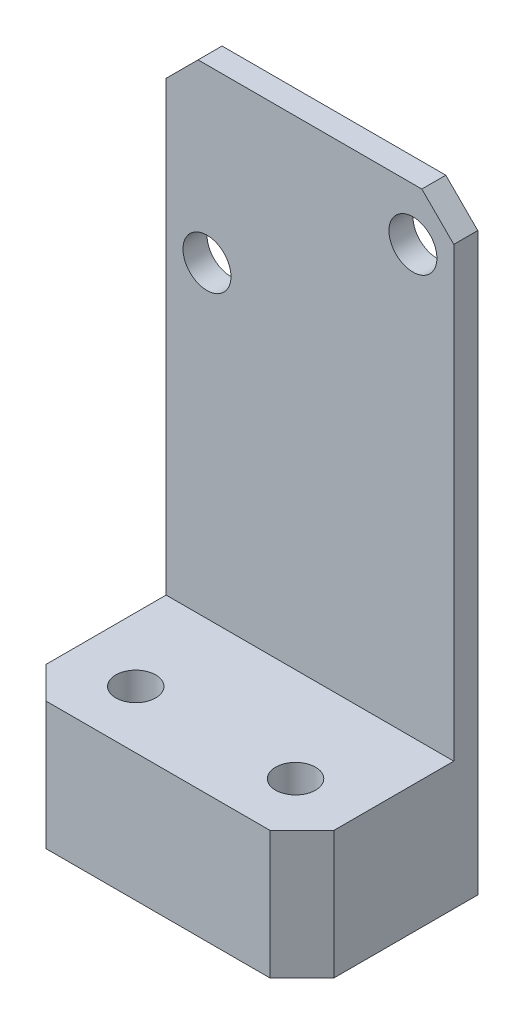
ISO-10303-21;
HEADER;
FILE_DESCRIPTION(('STEP AP214'),'2;1');
FILE_NAME('part.step','',(''),(''),'','','');
FILE_SCHEMA(('AUTOMOTIVE_DESIGN { 1 0 10303 214 1 1 1 1 }'));
ENDSEC;
DATA;
#1=APPLICATION_CONTEXT('core data for automotive mechanical design processes');
#2=APPLICATION_PROTOCOL_DEFINITION('international standard','automotive_design',2000,#1);
#3=PRODUCT_CONTEXT('',#1,'mechanical');
#4=PRODUCT('Part','Part','',(#3));
#5=PRODUCT_RELATED_PRODUCT_CATEGORY('part','',(#4));
#6=PRODUCT_DEFINITION_FORMATION('','',#4);
#7=PRODUCT_DEFINITION_CONTEXT('part definition',#1,'design');
#8=PRODUCT_DEFINITION('design','',#6,#7);
#9=PRODUCT_DEFINITION_SHAPE('','',#8);
#10=(LENGTH_UNIT() NAMED_UNIT(*) SI_UNIT(.MILLI.,.METRE.));
#11=(NAMED_UNIT(*) PLANE_ANGLE_UNIT() SI_UNIT($,.RADIAN.));
#12=(NAMED_UNIT(*) SI_UNIT($,.STERADIAN.) SOLID_ANGLE_UNIT());
#13=UNCERTAINTY_MEASURE_WITH_UNIT(LENGTH_MEASURE(1.E-05),#10,'distance_accuracy_value','');
#14=(GEOMETRIC_REPRESENTATION_CONTEXT(3) GLOBAL_UNCERTAINTY_ASSIGNED_CONTEXT((#13)) GLOBAL_UNIT_ASSIGNED_CONTEXT((#10,
#11,#12)) REPRESENTATION_CONTEXT('',''));
#15=CARTESIAN_POINT('',(0.,0.,0.));
#16=DIRECTION('',(0.,0.,1.));
#17=DIRECTION('',(1.,0.,0.));
#18=AXIS2_PLACEMENT_3D('',#15,#16,#17);
#19=CARTESIAN_POINT('',(-9.,7.,11.));
#20=DIRECTION('',(0.,-1.,0.));
#21=DIRECTION('',(0.,0.,-1.));
#22=AXIS2_PLACEMENT_3D('',#19,#20,#21);
#23=PLANE('',#22);
#24=DIRECTION('',(-1.,0.,0.));
#25=VECTOR('',#24,1.);
#26=CARTESIAN_POINT('',(-9.,7.,1.5));
#27=LINE('',#26,#25);
#28=CARTESIAN_POINT('',(7.00000000000001,7.,1.5));
#29=VERTEX_POINT('',#28);
#30=CARTESIAN_POINT('',(-7.,7.,1.5));
#31=VERTEX_POINT('',#30);
#32=EDGE_CURVE('E140',#29,#31,#27,.T.);
#33=ORIENTED_EDGE('',*,*,#32,.F.);
#34=DIRECTION('',(0.,0.,-1.));
#35=VECTOR('',#34,1.);
#36=CARTESIAN_POINT('',(6.99999999999999,7.,11.));
#37=LINE('',#36,#35);
#38=CARTESIAN_POINT('',(7.,7.,0.));
#39=VERTEX_POINT('',#38);
#40=EDGE_CURVE('E166',#29,#39,#37,.T.);
#41=ORIENTED_EDGE('',*,*,#40,.T.);
#42=DIRECTION('',(-1.,0.,0.));
#43=VECTOR('',#42,1.);
#44=CARTESIAN_POINT('',(-9.,7.,0.));
#45=LINE('',#44,#43);
#46=CARTESIAN_POINT('',(-6.99999999999999,7.,0.));
#47=VERTEX_POINT('',#46);
#48=EDGE_CURVE('E150',#39,#47,#45,.T.);
#49=ORIENTED_EDGE('',*,*,#48,.T.);
#50=DIRECTION('',(0.,0.,1.));
#51=VECTOR('',#50,1.);
#52=CARTESIAN_POINT('',(-6.99999999999999,7.,11.));
#53=LINE('',#52,#51);
#54=EDGE_CURVE('E164',#47,#31,#53,.T.);
#55=ORIENTED_EDGE('',*,*,#54,.T.);
#56=EDGE_LOOP('',(#33,#41,#49,#55));
#57=FACE_BOUND('',#56,.T.);
#58=ADVANCED_FACE('F34',(#57),#23,.F.);
#59=CARTESIAN_POINT('',(-9.,7.,11.));
#60=DIRECTION('',(1.,0.,0.));
#61=DIRECTION('',(0.,1.,0.));
#62=AXIS2_PLACEMENT_3D('',#59,#60,#61);
#63=PLANE('',#62);
#64=DIRECTION('',(0.,-1.,0.));
#65=VECTOR('',#64,1.);
#66=CARTESIAN_POINT('',(-9.,7.,1.5));
#67=LINE('',#66,#65);
#68=CARTESIAN_POINT('',(-9.,5.,1.5));
#69=VERTEX_POINT('',#68);
#70=CARTESIAN_POINT('',(-9.,-23.,1.5));
#71=VERTEX_POINT('',#70);
#72=EDGE_CURVE('E113',#69,#71,#67,.T.);
#73=ORIENTED_EDGE('',*,*,#72,.F.);
#74=DIRECTION('',(0.,0.,-1.));
#75=VECTOR('',#74,1.);
#76=CARTESIAN_POINT('',(-9.,5.,11.));
#77=LINE('',#76,#75);
#78=CARTESIAN_POINT('',(-9.,5.,0.));
#79=VERTEX_POINT('',#78);
#80=EDGE_CURVE('E181',#69,#79,#77,.T.);
#81=ORIENTED_EDGE('',*,*,#80,.T.);
#82=DIRECTION('',(0.,-1.,0.));
#83=VECTOR('',#82,1.);
#84=CARTESIAN_POINT('',(-9.,7.,0.));
#85=LINE('',#84,#83);
#86=CARTESIAN_POINT('',(-8.99999999999999,-31.,0.));
#87=VERTEX_POINT('',#86);
#88=EDGE_CURVE('E142',#79,#87,#85,.T.);
#89=ORIENTED_EDGE('',*,*,#88,.T.);
#90=DIRECTION('',(0.,0.,-1.));
#91=VECTOR('',#90,1.);
#92=CARTESIAN_POINT('',(-8.99999999999999,-31.,11.));
#93=LINE('',#92,#91);
#94=CARTESIAN_POINT('',(-8.99999999999999,-31.,8.99999999999998));
#95=VERTEX_POINT('',#94);
#96=EDGE_CURVE('E162',#95,#87,#93,.T.);
#97=ORIENTED_EDGE('',*,*,#96,.F.);
#98=DIRECTION('',(0.,1.,0.));
#99=VECTOR('',#98,1.);
#100=CARTESIAN_POINT('',(-9.,-23.,8.99999999999998));
#101=LINE('',#100,#99);
#102=CARTESIAN_POINT('',(-9.,-23.,8.99999999999998));
#103=VERTEX_POINT('',#102);
#104=EDGE_CURVE('E139',#95,#103,#101,.T.);
#105=ORIENTED_EDGE('',*,*,#104,.T.);
#106=DIRECTION('',(0.,0.,1.));
#107=VECTOR('',#106,1.);
#108=CARTESIAN_POINT('',(-9.,-23.,1.5));
#109=LINE('',#108,#107);
#110=EDGE_CURVE('E131',#71,#103,#109,.T.);
#111=ORIENTED_EDGE('',*,*,#110,.F.);
#112=EDGE_LOOP('',(#73,#81,#89,#97,#105,#111));
#113=FACE_BOUND('',#112,.T.);
#114=ADVANCED_FACE('F137',(#113),#63,.F.);
#115=CARTESIAN_POINT('',(-8.99999999999999,-31.,11.));
#116=DIRECTION('',(0.,1.,0.));
#117=DIRECTION('',(0.,0.,1.));
#118=AXIS2_PLACEMENT_3D('',#115,#116,#117);
#119=PLANE('',#118);
#120=CARTESIAN_POINT('',(5.,-31.,7.4));
#121=DIRECTION('',(0.,1.,0.));
#122=DIRECTION('',(0.,0.,1.));
#123=AXIS2_PLACEMENT_3D('',#120,#121,#122);
#124=CIRCLE('',#123,1.25);
#125=CARTESIAN_POINT('',(5.,-31.,8.65));
#126=VERTEX_POINT('',#125);
#127=EDGE_CURVE('E276',#126,#126,#124,.F.);
#128=ORIENTED_EDGE('',*,*,#127,.F.);
#129=EDGE_LOOP('',(#128));
#130=FACE_BOUND('',#129,.T.);
#131=CARTESIAN_POINT('',(-5.,-31.,7.4));
#132=DIRECTION('',(0.,1.,0.));
#133=DIRECTION('',(0.,0.,1.));
#134=AXIS2_PLACEMENT_3D('',#131,#132,#133);
#135=CIRCLE('',#134,1.25);
#136=CARTESIAN_POINT('',(-5.,-31.,8.65));
#137=VERTEX_POINT('',#136);
#138=EDGE_CURVE('E270',#137,#137,#135,.F.);
#139=ORIENTED_EDGE('',*,*,#138,.F.);
#140=EDGE_LOOP('',(#139));
#141=FACE_BOUND('',#140,.T.);
#142=DIRECTION('',(1.,0.,0.));
#143=VECTOR('',#142,1.);
#144=CARTESIAN_POINT('',(-8.99999999999999,-31.,11.));
#145=LINE('',#144,#143);
#146=CARTESIAN_POINT('',(-6.99999999999998,-31.,11.));
#147=VERTEX_POINT('',#146);
#148=CARTESIAN_POINT('',(7.,-31.,11.));
#149=VERTEX_POINT('',#148);
#150=EDGE_CURVE('E147',#147,#149,#145,.T.);
#151=ORIENTED_EDGE('',*,*,#150,.F.);
#152=DIRECTION('',(-0.707106781186547,0.,-0.707106781186548));
#153=VECTOR('',#152,1.);
#154=CARTESIAN_POINT('',(-6.99999999999998,-31.,11.));
#155=LINE('',#154,#153);
#156=EDGE_CURVE('E57',#147,#95,#155,.T.);
#157=ORIENTED_EDGE('',*,*,#156,.T.);
#158=ORIENTED_EDGE('',*,*,#96,.T.);
#159=DIRECTION('',(1.,0.,0.));
#160=VECTOR('',#159,1.);
#161=CARTESIAN_POINT('',(-8.99999999999999,-31.,0.));
#162=LINE('',#161,#160);
#163=CARTESIAN_POINT('',(9.,-31.,0.));
#164=VERTEX_POINT('',#163);
#165=EDGE_CURVE('E153',#87,#164,#162,.T.);
#166=ORIENTED_EDGE('',*,*,#165,.T.);
#167=DIRECTION('',(0.,0.,-1.));
#168=VECTOR('',#167,1.);
#169=CARTESIAN_POINT('',(9.,-31.,11.));
#170=LINE('',#169,#168);
#171=CARTESIAN_POINT('',(9.,-31.,8.99999999999999));
#172=VERTEX_POINT('',#171);
#173=EDGE_CURVE('E149',#172,#164,#170,.T.);
#174=ORIENTED_EDGE('',*,*,#173,.F.);
#175=DIRECTION('',(-0.707106781186547,0.,0.707106781186548));
#176=VECTOR('',#175,1.);
#177=CARTESIAN_POINT('',(7.,-31.,11.));
#178=LINE('',#177,#176);
#179=EDGE_CURVE('E49',#172,#149,#178,.T.);
#180=ORIENTED_EDGE('',*,*,#179,.T.);
#181=EDGE_LOOP('',(#151,#157,#158,#166,#174,#180));
#182=FACE_BOUND('',#181,.T.);
#183=ADVANCED_FACE('F198',(#130,#141,#182),#119,.F.);
#184=CARTESIAN_POINT('',(9.,7.,11.));
#185=DIRECTION('',(-1.,0.,0.));
#186=DIRECTION('',(0.,-1.,0.));
#187=AXIS2_PLACEMENT_3D('',#184,#185,#186);
#188=PLANE('',#187);
#189=DIRECTION('',(0.,1.,0.));
#190=VECTOR('',#189,1.);
#191=CARTESIAN_POINT('',(9.,7.,0.));
#192=LINE('',#191,#190);
#193=CARTESIAN_POINT('',(9.,4.99999999999999,0.));
#194=VERTEX_POINT('',#193);
#195=EDGE_CURVE('E156',#164,#194,#192,.T.);
#196=ORIENTED_EDGE('',*,*,#195,.T.);
#197=DIRECTION('',(0.,0.,1.));
#198=VECTOR('',#197,1.);
#199=CARTESIAN_POINT('',(9.,4.99999999999999,11.));
#200=LINE('',#199,#198);
#201=CARTESIAN_POINT('',(9.00000000000001,5.,1.5));
#202=VERTEX_POINT('',#201);
#203=EDGE_CURVE('E175',#194,#202,#200,.T.);
#204=ORIENTED_EDGE('',*,*,#203,.T.);
#205=DIRECTION('',(0.,1.,0.));
#206=VECTOR('',#205,1.);
#207=CARTESIAN_POINT('',(9.,7.,1.5));
#208=LINE('',#207,#206);
#209=CARTESIAN_POINT('',(9.,-23.,1.5));
#210=VERTEX_POINT('',#209);
#211=EDGE_CURVE('E135',#210,#202,#208,.T.);
#212=ORIENTED_EDGE('',*,*,#211,.F.);
#213=DIRECTION('',(0.,0.,1.));
#214=VECTOR('',#213,1.);
#215=CARTESIAN_POINT('',(9.,-23.,1.5));
#216=LINE('',#215,#214);
#217=CARTESIAN_POINT('',(9.,-23.,8.99999999999999));
#218=VERTEX_POINT('',#217);
#219=EDGE_CURVE('E134',#210,#218,#216,.T.);
#220=ORIENTED_EDGE('',*,*,#219,.T.);
#221=DIRECTION('',(0.,-1.,0.));
#222=VECTOR('',#221,1.);
#223=CARTESIAN_POINT('',(9.,-31.,8.99999999999999));
#224=LINE('',#223,#222);
#225=EDGE_CURVE('E173',#218,#172,#224,.T.);
#226=ORIENTED_EDGE('',*,*,#225,.T.);
#227=ORIENTED_EDGE('',*,*,#173,.T.);
#228=EDGE_LOOP('',(#196,#204,#212,#220,#226,#227));
#229=FACE_BOUND('',#228,.T.);
#230=ADVANCED_FACE('F195',(#229),#188,.F.);
#231=CARTESIAN_POINT('',(-8.99999999999999,-31.,11.));
#232=DIRECTION('',(0.,0.,1.));
#233=DIRECTION('',(1.,0.,0.));
#234=AXIS2_PLACEMENT_3D('',#231,#232,#233);
#235=PLANE('',#234);
#236=DIRECTION('',(1.,0.,0.));
#237=VECTOR('',#236,1.);
#238=CARTESIAN_POINT('',(-9.,-23.,11.));
#239=LINE('',#238,#237);
#240=CARTESIAN_POINT('',(-6.99999999999998,-23.,11.));
#241=VERTEX_POINT('',#240);
#242=CARTESIAN_POINT('',(7.,-23.,11.));
#243=VERTEX_POINT('',#242);
#244=EDGE_CURVE('E126',#241,#243,#239,.T.);
#245=ORIENTED_EDGE('',*,*,#244,.F.);
#246=DIRECTION('',(0.,-1.,0.));
#247=VECTOR('',#246,1.);
#248=CARTESIAN_POINT('',(-6.99999999999998,-31.,11.));
#249=LINE('',#248,#247);
#250=EDGE_CURVE('E186',#241,#147,#249,.T.);
#251=ORIENTED_EDGE('',*,*,#250,.T.);
#252=ORIENTED_EDGE('',*,*,#150,.T.);
#253=DIRECTION('',(0.,1.,0.));
#254=VECTOR('',#253,1.);
#255=CARTESIAN_POINT('',(7.,-23.,11.));
#256=LINE('',#255,#254);
#257=EDGE_CURVE('E183',#149,#243,#256,.T.);
#258=ORIENTED_EDGE('',*,*,#257,.T.);
#259=EDGE_LOOP('',(#245,#251,#252,#258));
#260=FACE_BOUND('',#259,.T.);
#261=ADVANCED_FACE('F197',(#260),#235,.T.);
#262=CARTESIAN_POINT('',(-8.99999999999999,-31.,0.));
#263=DIRECTION('',(0.,0.,1.));
#264=DIRECTION('',(1.,0.,0.));
#265=AXIS2_PLACEMENT_3D('',#262,#263,#264);
#266=PLANE('',#265);
#267=CARTESIAN_POINT('',(-6.44322900415622,-3.72,0.));
#268=DIRECTION('',(0.,0.,1.));
#269=DIRECTION('',(1.,0.,0.));
#270=AXIS2_PLACEMENT_3D('',#267,#268,#269);
#271=CIRCLE('',#270,1.5);
#272=CARTESIAN_POINT('',(-4.94322900415622,-3.72,0.));
#273=VERTEX_POINT('',#272);
#274=EDGE_CURVE('E255',#273,#273,#271,.F.);
#275=ORIENTED_EDGE('',*,*,#274,.F.);
#276=EDGE_LOOP('',(#275));
#277=FACE_BOUND('',#276,.T.);
#278=CARTESIAN_POINT('',(6.44322900415622,3.72,0.));
#279=DIRECTION('',(0.,0.,1.));
#280=DIRECTION('',(1.,0.,0.));
#281=AXIS2_PLACEMENT_3D('',#278,#279,#280);
#282=CIRCLE('',#281,1.5);
#283=CARTESIAN_POINT('',(7.94322900415622,3.72,0.));
#284=VERTEX_POINT('',#283);
#285=EDGE_CURVE('E258',#284,#284,#282,.F.);
#286=ORIENTED_EDGE('',*,*,#285,.F.);
#287=EDGE_LOOP('',(#286));
#288=FACE_BOUND('',#287,.T.);
#289=ORIENTED_EDGE('',*,*,#48,.F.);
#290=DIRECTION('',(-0.707106781186547,0.707106781186548,0.));
#291=VECTOR('',#290,1.);
#292=CARTESIAN_POINT('',(6.99999999999999,7.,0.));
#293=LINE('',#292,#291);
#294=EDGE_CURVE('E171',#39,#194,#293,.F.);
#295=ORIENTED_EDGE('',*,*,#294,.T.);
#296=ORIENTED_EDGE('',*,*,#195,.F.);
#297=ORIENTED_EDGE('',*,*,#165,.F.);
#298=ORIENTED_EDGE('',*,*,#88,.F.);
#299=DIRECTION('',(-0.707106781186548,-0.707106781186547,0.));
#300=VECTOR('',#299,1.);
#301=CARTESIAN_POINT('',(-9.,5.,0.));
#302=LINE('',#301,#300);
#303=EDGE_CURVE('E169',#79,#47,#302,.F.);
#304=ORIENTED_EDGE('',*,*,#303,.T.);
#305=EDGE_LOOP('',(#289,#295,#296,#297,#298,#304));
#306=FACE_BOUND('',#305,.T.);
#307=ADVANCED_FACE('F221',(#277,#288,#306),#266,.F.);
#308=CARTESIAN_POINT('',(-9.,-23.,1.5));
#309=DIRECTION('',(0.,-1.,0.));
#310=DIRECTION('',(0.,0.,-1.));
#311=AXIS2_PLACEMENT_3D('',#308,#309,#310);
#312=PLANE('',#311);
#313=CARTESIAN_POINT('',(5.,-23.,7.4));
#314=DIRECTION('',(0.,1.,0.));
#315=DIRECTION('',(-1.,0.,0.));
#316=AXIS2_PLACEMENT_3D('',#313,#314,#315);
#317=CIRCLE('',#316,1.25);
#318=CARTESIAN_POINT('',(3.75,-23.,7.4));
#319=VERTEX_POINT('',#318);
#320=EDGE_CURVE('E279',#319,#319,#317,.T.);
#321=ORIENTED_EDGE('',*,*,#320,.F.);
#322=EDGE_LOOP('',(#321));
#323=FACE_BOUND('',#322,.T.);
#324=CARTESIAN_POINT('',(-5.,-23.,7.4));
#325=DIRECTION('',(0.,1.,0.));
#326=DIRECTION('',(-1.,0.,0.));
#327=AXIS2_PLACEMENT_3D('',#324,#325,#326);
#328=CIRCLE('',#327,1.25);
#329=CARTESIAN_POINT('',(-6.25,-23.,7.4));
#330=VERTEX_POINT('',#329);
#331=EDGE_CURVE('E273',#330,#330,#328,.T.);
#332=ORIENTED_EDGE('',*,*,#331,.F.);
#333=EDGE_LOOP('',(#332));
#334=FACE_BOUND('',#333,.T.);
#335=ORIENTED_EDGE('',*,*,#110,.T.);
#336=DIRECTION('',(0.707106781186547,0.,0.707106781186548));
#337=VECTOR('',#336,1.);
#338=CARTESIAN_POINT('',(-6.99999999999998,-23.,11.));
#339=LINE('',#338,#337);
#340=EDGE_CURVE('E11',#103,#241,#339,.T.);
#341=ORIENTED_EDGE('',*,*,#340,.T.);
#342=ORIENTED_EDGE('',*,*,#244,.T.);
#343=DIRECTION('',(0.707106781186547,0.,-0.707106781186548));
#344=VECTOR('',#343,1.);
#345=CARTESIAN_POINT('',(7.,-23.,11.));
#346=LINE('',#345,#344);
#347=EDGE_CURVE('E42',#243,#218,#346,.T.);
#348=ORIENTED_EDGE('',*,*,#347,.T.);
#349=ORIENTED_EDGE('',*,*,#219,.F.);
#350=DIRECTION('',(1.,0.,0.));
#351=VECTOR('',#350,1.);
#352=CARTESIAN_POINT('',(-9.,-23.,1.5));
#353=LINE('',#352,#351);
#354=EDGE_CURVE('E117',#71,#210,#353,.T.);
#355=ORIENTED_EDGE('',*,*,#354,.F.);
#356=EDGE_LOOP('',(#335,#341,#342,#348,#349,#355));
#357=FACE_BOUND('',#356,.T.);
#358=ADVANCED_FACE('F130',(#323,#334,#357),#312,.F.);
#359=CARTESIAN_POINT('',(-9.,-23.,1.5));
#360=DIRECTION('',(0.,0.,1.));
#361=DIRECTION('',(1.,0.,0.));
#362=AXIS2_PLACEMENT_3D('',#359,#360,#361);
#363=PLANE('',#362);
#364=CARTESIAN_POINT('',(-6.44322900415622,-3.72,1.5));
#365=DIRECTION('',(0.,0.,1.));
#366=DIRECTION('',(1.,0.,0.));
#367=AXIS2_PLACEMENT_3D('',#364,#365,#366);
#368=CIRCLE('',#367,1.5);
#369=CARTESIAN_POINT('',(-4.94322900415622,-3.72,1.5));
#370=VERTEX_POINT('',#369);
#371=EDGE_CURVE('E267',#370,#370,#368,.T.);
#372=ORIENTED_EDGE('',*,*,#371,.F.);
#373=EDGE_LOOP('',(#372));
#374=FACE_BOUND('',#373,.T.);
#375=CARTESIAN_POINT('',(6.44322900415622,3.72,1.5));
#376=DIRECTION('',(0.,0.,1.));
#377=DIRECTION('',(1.,0.,0.));
#378=AXIS2_PLACEMENT_3D('',#375,#376,#377);
#379=CIRCLE('',#378,1.5);
#380=CARTESIAN_POINT('',(7.94322900415622,3.72,1.5));
#381=VERTEX_POINT('',#380);
#382=EDGE_CURVE('E260',#381,#381,#379,.T.);
#383=ORIENTED_EDGE('',*,*,#382,.F.);
#384=EDGE_LOOP('',(#383));
#385=FACE_BOUND('',#384,.T.);
#386=ORIENTED_EDGE('',*,*,#211,.T.);
#387=DIRECTION('',(0.707106781186547,-0.707106781186548,0.));
#388=VECTOR('',#387,1.);
#389=CARTESIAN_POINT('',(14.,0.,1.5));
#390=LINE('',#389,#388);
#391=EDGE_CURVE('E178',#202,#29,#390,.F.);
#392=ORIENTED_EDGE('',*,*,#391,.T.);
#393=ORIENTED_EDGE('',*,*,#32,.T.);
#394=DIRECTION('',(0.707106781186548,0.707106781186547,0.));
#395=VECTOR('',#394,1.);
#396=CARTESIAN_POINT('',(-23.,-8.99999999999997,1.5));
#397=LINE('',#396,#395);
#398=EDGE_CURVE('E121',#31,#69,#397,.F.);
#399=ORIENTED_EDGE('',*,*,#398,.T.);
#400=ORIENTED_EDGE('',*,*,#72,.T.);
#401=ORIENTED_EDGE('',*,*,#354,.T.);
#402=EDGE_LOOP('',(#386,#392,#393,#399,#400,#401));
#403=FACE_BOUND('',#402,.T.);
#404=ADVANCED_FACE('F116',(#374,#385,#403),#363,.T.);
#405=CARTESIAN_POINT('',(6.44322900415622,3.72,-4.24264068711929));
#406=DIRECTION('',(0.,0.,1.));
#407=DIRECTION('',(1.,0.,0.));
#408=AXIS2_PLACEMENT_3D('',#405,#406,#407);
#409=CYLINDRICAL_SURFACE('',#408,1.5);
#410=ORIENTED_EDGE('',*,*,#285,.T.);
#411=EDGE_LOOP('',(#410));
#412=FACE_BOUND('',#411,.T.);
#413=ORIENTED_EDGE('',*,*,#382,.T.);
#414=EDGE_LOOP('',(#413));
#415=FACE_BOUND('',#414,.T.);
#416=ADVANCED_FACE('F293',(#412,#415),#409,.F.);
#417=CARTESIAN_POINT('',(-6.44322900415622,-3.72,-4.24264068711929));
#418=DIRECTION('',(0.,0.,1.));
#419=DIRECTION('',(1.,0.,0.));
#420=AXIS2_PLACEMENT_3D('',#417,#418,#419);
#421=CYLINDRICAL_SURFACE('',#420,1.5);
#422=ORIENTED_EDGE('',*,*,#274,.T.);
#423=EDGE_LOOP('',(#422));
#424=FACE_BOUND('',#423,.T.);
#425=ORIENTED_EDGE('',*,*,#371,.T.);
#426=EDGE_LOOP('',(#425));
#427=FACE_BOUND('',#426,.T.);
#428=ADVANCED_FACE('F287',(#424,#427),#421,.F.);
#429=CARTESIAN_POINT('',(-5.,-34.5355339059327,7.4));
#430=DIRECTION('',(0.,1.,0.));
#431=DIRECTION('',(-1.,0.,0.));
#432=AXIS2_PLACEMENT_3D('',#429,#430,#431);
#433=CYLINDRICAL_SURFACE('',#432,1.25);
#434=ORIENTED_EDGE('',*,*,#138,.T.);
#435=EDGE_LOOP('',(#434));
#436=FACE_BOUND('',#435,.T.);
#437=ORIENTED_EDGE('',*,*,#331,.T.);
#438=EDGE_LOOP('',(#437));
#439=FACE_BOUND('',#438,.T.);
#440=ADVANCED_FACE('F234',(#436,#439),#433,.F.);
#441=CARTESIAN_POINT('',(5.,-34.5355339059327,7.4));
#442=DIRECTION('',(0.,1.,0.));
#443=DIRECTION('',(-1.,0.,0.));
#444=AXIS2_PLACEMENT_3D('',#441,#442,#443);
#445=CYLINDRICAL_SURFACE('',#444,1.25);
#446=ORIENTED_EDGE('',*,*,#127,.T.);
#447=EDGE_LOOP('',(#446));
#448=FACE_BOUND('',#447,.T.);
#449=ORIENTED_EDGE('',*,*,#320,.T.);
#450=EDGE_LOOP('',(#449));
#451=FACE_BOUND('',#450,.T.);
#452=ADVANCED_FACE('F229',(#448,#451),#445,.F.);
#453=CARTESIAN_POINT('',(6.99999999999999,7.,11.));
#454=DIRECTION('',(-0.707106781186548,-0.707106781186547,0.));
#455=DIRECTION('',(0.707106781186547,-0.707106781186548,0.));
#456=AXIS2_PLACEMENT_3D('',#453,#454,#455);
#457=PLANE('',#456);
#458=ORIENTED_EDGE('',*,*,#391,.F.);
#459=ORIENTED_EDGE('',*,*,#203,.F.);
#460=ORIENTED_EDGE('',*,*,#294,.F.);
#461=ORIENTED_EDGE('',*,*,#40,.F.);
#462=EDGE_LOOP('',(#458,#459,#460,#461));
#463=FACE_BOUND('',#462,.T.);
#464=ADVANCED_FACE('F208',(#463),#457,.F.);
#465=CARTESIAN_POINT('',(-9.,5.,11.));
#466=DIRECTION('',(0.707106781186547,-0.707106781186548,0.));
#467=DIRECTION('',(0.707106781186548,0.707106781186547,0.));
#468=AXIS2_PLACEMENT_3D('',#465,#466,#467);
#469=PLANE('',#468);
#470=ORIENTED_EDGE('',*,*,#398,.F.);
#471=ORIENTED_EDGE('',*,*,#54,.F.);
#472=ORIENTED_EDGE('',*,*,#303,.F.);
#473=ORIENTED_EDGE('',*,*,#80,.F.);
#474=EDGE_LOOP('',(#470,#471,#472,#473));
#475=FACE_BOUND('',#474,.T.);
#476=ADVANCED_FACE('F203',(#475),#469,.F.);
#477=CARTESIAN_POINT('',(-6.99999999999998,-31.,11.));
#478=DIRECTION('',(-0.707106781186548,0.,0.707106781186547));
#479=DIRECTION('',(0.707106781186547,0.,0.707106781186548));
#480=AXIS2_PLACEMENT_3D('',#477,#478,#479);
#481=PLANE('',#480);
#482=ORIENTED_EDGE('',*,*,#340,.F.);
#483=ORIENTED_EDGE('',*,*,#104,.F.);
#484=ORIENTED_EDGE('',*,*,#156,.F.);
#485=ORIENTED_EDGE('',*,*,#250,.F.);
#486=EDGE_LOOP('',(#482,#483,#484,#485));
#487=FACE_BOUND('',#486,.T.);
#488=ADVANCED_FACE('F201',(#487),#481,.T.);
#489=CARTESIAN_POINT('',(7.,-31.,11.));
#490=DIRECTION('',(0.707106781186548,0.,0.707106781186547));
#491=DIRECTION('',(0.707106781186547,0.,-0.707106781186548));
#492=AXIS2_PLACEMENT_3D('',#489,#490,#491);
#493=PLANE('',#492);
#494=ORIENTED_EDGE('',*,*,#179,.F.);
#495=ORIENTED_EDGE('',*,*,#225,.F.);
#496=ORIENTED_EDGE('',*,*,#347,.F.);
#497=ORIENTED_EDGE('',*,*,#257,.F.);
#498=EDGE_LOOP('',(#494,#495,#496,#497));
#499=FACE_BOUND('',#498,.T.);
#500=ADVANCED_FACE('F36',(#499),#493,.T.);
#501=CLOSED_SHELL('',(#58,#114,#183,#230,#261,#307,#358,#404,#416,#428,#440,#452,#464,#476,#488,#500));
#502=MANIFOLD_SOLID_BREP('B2',#501);
#503=ADVANCED_BREP_SHAPE_REPRESENTATION('',(#18,#502),#14);
#504=SHAPE_DEFINITION_REPRESENTATION(#9,#503);
ENDSEC;
END-ISO-10303-21;
